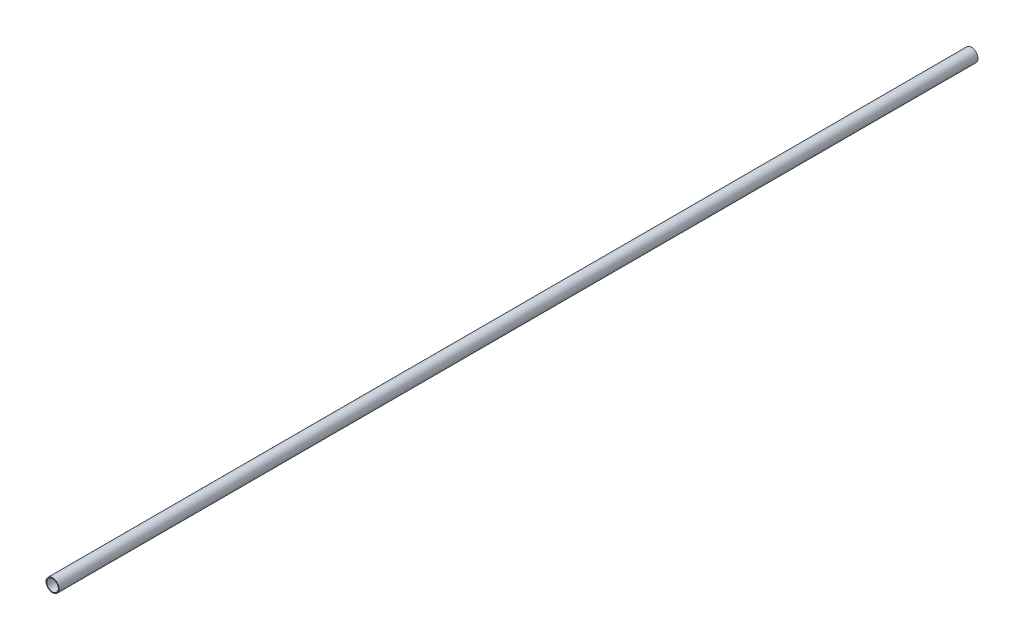
ISO-10303-21;
HEADER;
FILE_DESCRIPTION(('STEP AP214'),'2;1');
FILE_NAME('part.step','',(''),(''),'','','');
FILE_SCHEMA(('AUTOMOTIVE_DESIGN { 1 0 10303 214 1 1 1 1 }'));
ENDSEC;
DATA;
#1=APPLICATION_CONTEXT('core data for automotive mechanical design processes');
#2=APPLICATION_PROTOCOL_DEFINITION('international standard','automotive_design',2000,#1);
#3=PRODUCT_CONTEXT('',#1,'mechanical');
#4=PRODUCT('Part','Part','',(#3));
#5=PRODUCT_RELATED_PRODUCT_CATEGORY('part','',(#4));
#6=PRODUCT_DEFINITION_FORMATION('','',#4);
#7=PRODUCT_DEFINITION_CONTEXT('part definition',#1,'design');
#8=PRODUCT_DEFINITION('design','',#6,#7);
#9=PRODUCT_DEFINITION_SHAPE('','',#8);
#10=(LENGTH_UNIT() NAMED_UNIT(*) SI_UNIT(.MILLI.,.METRE.));
#11=(NAMED_UNIT(*) PLANE_ANGLE_UNIT() SI_UNIT($,.RADIAN.));
#12=(NAMED_UNIT(*) SI_UNIT($,.STERADIAN.) SOLID_ANGLE_UNIT());
#13=UNCERTAINTY_MEASURE_WITH_UNIT(LENGTH_MEASURE(1.E-05),#10,'distance_accuracy_value','');
#14=(GEOMETRIC_REPRESENTATION_CONTEXT(3) GLOBAL_UNCERTAINTY_ASSIGNED_CONTEXT((#13)) GLOBAL_UNIT_ASSIGNED_CONTEXT((#10,
#11,#12)) REPRESENTATION_CONTEXT('',''));
#15=CARTESIAN_POINT('',(0.,0.,0.));
#16=DIRECTION('',(0.,0.,1.));
#17=DIRECTION('',(1.,0.,0.));
#18=AXIS2_PLACEMENT_3D('',#15,#16,#17);
#19=CARTESIAN_POINT('',(0.,0.,457.2));
#20=DIRECTION('',(0.,0.,1.));
#21=DIRECTION('',(1.,0.,0.));
#22=AXIS2_PLACEMENT_3D('',#19,#20,#21);
#23=PLANE('',#22);
#24=CARTESIAN_POINT('',(0.,0.,457.2));
#25=DIRECTION('',(0.,0.,1.));
#26=DIRECTION('',(1.,0.,0.));
#27=AXIS2_PLACEMENT_3D('',#24,#25,#26);
#28=CIRCLE('',#27,6.5);
#29=CARTESIAN_POINT('',(6.5,0.,457.2));
#30=VERTEX_POINT('',#29);
#31=EDGE_CURVE('E10',#30,#30,#28,.T.);
#32=ORIENTED_EDGE('',*,*,#31,.T.);
#33=EDGE_LOOP('',(#32));
#34=FACE_BOUND('',#33,.T.);
#35=CARTESIAN_POINT('',(0.,0.,457.2));
#36=DIRECTION('',(0.,0.,1.));
#37=DIRECTION('',(1.,0.,0.));
#38=AXIS2_PLACEMENT_3D('',#35,#36,#37);
#39=CIRCLE('',#38,5.75000000000001);
#40=CARTESIAN_POINT('',(5.75000000000001,0.,457.2));
#41=VERTEX_POINT('',#40);
#42=EDGE_CURVE('E50',#41,#41,#39,.T.);
#43=ORIENTED_EDGE('',*,*,#42,.F.);
#44=EDGE_LOOP('',(#43));
#45=FACE_BOUND('',#44,.T.);
#46=ADVANCED_FACE('F37',(#34,#45),#23,.T.);
#47=CARTESIAN_POINT('',(0.,0.,-457.2));
#48=DIRECTION('',(0.,0.,1.));
#49=DIRECTION('',(1.,0.,0.));
#50=AXIS2_PLACEMENT_3D('',#47,#48,#49);
#51=PLANE('',#50);
#52=CARTESIAN_POINT('',(0.,0.,-457.2));
#53=DIRECTION('',(0.,0.,1.));
#54=DIRECTION('',(1.,0.,0.));
#55=AXIS2_PLACEMENT_3D('',#52,#53,#54);
#56=CIRCLE('',#55,6.5);
#57=CARTESIAN_POINT('',(6.5,0.,-457.2));
#58=VERTEX_POINT('',#57);
#59=EDGE_CURVE('E41',#58,#58,#56,.T.);
#60=ORIENTED_EDGE('',*,*,#59,.F.);
#61=EDGE_LOOP('',(#60));
#62=FACE_BOUND('',#61,.T.);
#63=CARTESIAN_POINT('',(0.,0.,-457.2));
#64=DIRECTION('',(0.,0.,1.));
#65=DIRECTION('',(1.,0.,0.));
#66=AXIS2_PLACEMENT_3D('',#63,#64,#65);
#67=CIRCLE('',#66,5.75000000000001);
#68=CARTESIAN_POINT('',(5.75000000000001,0.,-457.2));
#69=VERTEX_POINT('',#68);
#70=EDGE_CURVE('E52',#69,#69,#67,.T.);
#71=ORIENTED_EDGE('',*,*,#70,.T.);
#72=EDGE_LOOP('',(#71));
#73=FACE_BOUND('',#72,.T.);
#74=ADVANCED_FACE('F64',(#62,#73),#51,.F.);
#75=CARTESIAN_POINT('',(0.,0.,457.2));
#76=DIRECTION('',(0.,0.,-1.));
#77=DIRECTION('',(-1.,0.,0.));
#78=AXIS2_PLACEMENT_3D('',#75,#76,#77);
#79=CYLINDRICAL_SURFACE('',#78,6.5);
#80=ORIENTED_EDGE('',*,*,#31,.F.);
#81=EDGE_LOOP('',(#80));
#82=FACE_BOUND('',#81,.T.);
#83=ORIENTED_EDGE('',*,*,#59,.T.);
#84=EDGE_LOOP('',(#83));
#85=FACE_BOUND('',#84,.T.);
#86=ADVANCED_FACE('F39',(#82,#85),#79,.T.);
#87=CARTESIAN_POINT('',(0.,0.,457.2));
#88=DIRECTION('',(0.,0.,-1.));
#89=DIRECTION('',(-1.,0.,0.));
#90=AXIS2_PLACEMENT_3D('',#87,#88,#89);
#91=CYLINDRICAL_SURFACE('',#90,5.75000000000001);
#92=ORIENTED_EDGE('',*,*,#42,.T.);
#93=EDGE_LOOP('',(#92));
#94=FACE_BOUND('',#93,.T.);
#95=ORIENTED_EDGE('',*,*,#70,.F.);
#96=EDGE_LOOP('',(#95));
#97=FACE_BOUND('',#96,.T.);
#98=ADVANCED_FACE('F60',(#94,#97),#91,.F.);
#99=CLOSED_SHELL('',(#46,#74,#86,#98));
#100=MANIFOLD_SOLID_BREP('B2',#99);
#101=ADVANCED_BREP_SHAPE_REPRESENTATION('',(#18,#100),#14);
#102=SHAPE_DEFINITION_REPRESENTATION(#9,#101);
ENDSEC;
END-ISO-10303-21;
